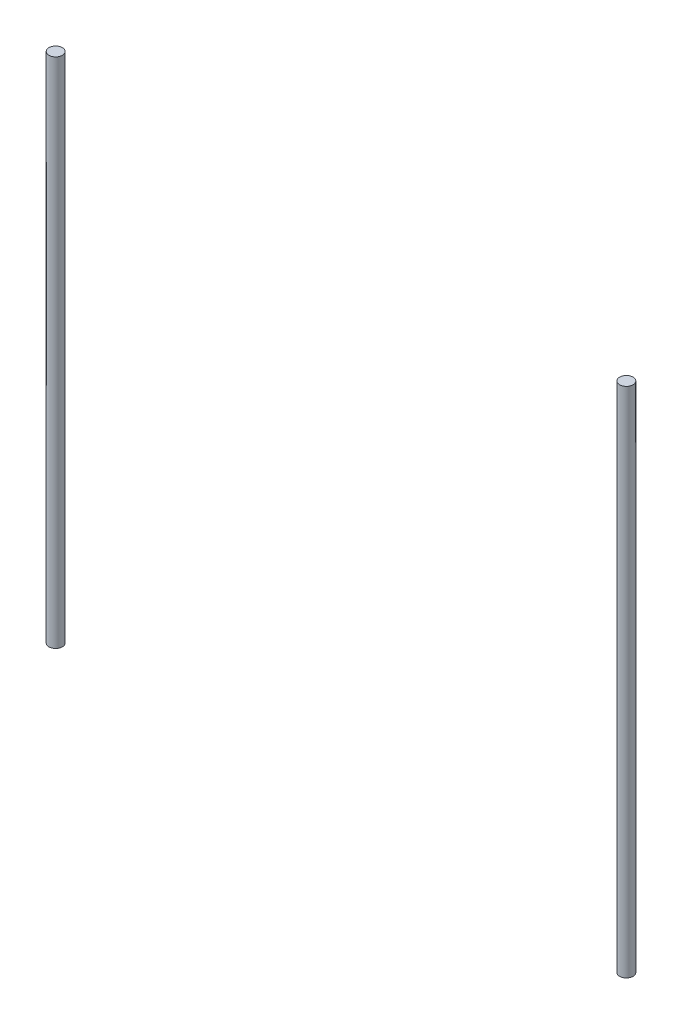
ISO-10303-21;
HEADER;
FILE_DESCRIPTION(('STEP AP214'),'2;1');
FILE_NAME('part.step','',(''),(''),'','','');
FILE_SCHEMA(('AUTOMOTIVE_DESIGN { 1 0 10303 214 1 1 1 1 }'));
ENDSEC;
DATA;
#1=APPLICATION_CONTEXT('core data for automotive mechanical design processes');
#2=APPLICATION_PROTOCOL_DEFINITION('international standard','automotive_design',2000,#1);
#3=PRODUCT_CONTEXT('',#1,'mechanical');
#4=PRODUCT('Part','Part','',(#3));
#5=PRODUCT_RELATED_PRODUCT_CATEGORY('part','',(#4));
#6=PRODUCT_DEFINITION_FORMATION('','',#4);
#7=PRODUCT_DEFINITION_CONTEXT('part definition',#1,'design');
#8=PRODUCT_DEFINITION('design','',#6,#7);
#9=PRODUCT_DEFINITION_SHAPE('','',#8);
#10=(LENGTH_UNIT() NAMED_UNIT(*) SI_UNIT(.MILLI.,.METRE.));
#11=(NAMED_UNIT(*) PLANE_ANGLE_UNIT() SI_UNIT($,.RADIAN.));
#12=(NAMED_UNIT(*) SI_UNIT($,.STERADIAN.) SOLID_ANGLE_UNIT());
#13=UNCERTAINTY_MEASURE_WITH_UNIT(LENGTH_MEASURE(1.E-05),#10,'distance_accuracy_value','');
#14=(GEOMETRIC_REPRESENTATION_CONTEXT(3) GLOBAL_UNCERTAINTY_ASSIGNED_CONTEXT((#13)) GLOBAL_UNIT_ASSIGNED_CONTEXT((#10,
#11,#12)) REPRESENTATION_CONTEXT('',''));
#15=CARTESIAN_POINT('',(0.,0.,0.));
#16=DIRECTION('',(0.,0.,1.));
#17=DIRECTION('',(1.,0.,0.));
#18=AXIS2_PLACEMENT_3D('',#15,#16,#17);
#19=CARTESIAN_POINT('',(-68.3434798742715,397.339775395496,369.677889561147));
#20=DIRECTION('',(0.,-1.,0.));
#21=DIRECTION('',(0.,0.,-1.));
#22=AXIS2_PLACEMENT_3D('',#19,#20,#21);
#23=PLANE('',#22);
#24=CARTESIAN_POINT('',(-68.3434798742715,397.339775395496,369.677889561147));
#25=DIRECTION('',(0.,-1.,0.));
#26=DIRECTION('',(0.,0.,-1.));
#27=AXIS2_PLACEMENT_3D('',#24,#25,#26);
#28=CIRCLE('',#27,4.);
#29=CARTESIAN_POINT('',(-68.3434798742715,397.339775395496,365.677889561147));
#30=VERTEX_POINT('',#29);
#31=EDGE_CURVE('P0_E17',#30,#30,#28,.T.);
#32=ORIENTED_EDGE('',*,*,#31,.F.);
#33=EDGE_LOOP('',(#32));
#34=FACE_BOUND('',#33,.T.);
#35=ADVANCED_FACE('P0_F14',(#34),#23,.F.);
#36=CARTESIAN_POINT('',(-68.3434798742715,90.3397753954964,369.677889561147));
#37=DIRECTION('',(0.,-1.,0.));
#38=DIRECTION('',(0.,0.,-1.));
#39=AXIS2_PLACEMENT_3D('',#36,#37,#38);
#40=PLANE('',#39);
#41=CARTESIAN_POINT('',(-68.3434798742715,90.3397753954964,369.677889561147));
#42=DIRECTION('',(0.,-1.,0.));
#43=DIRECTION('',(0.,0.,-1.));
#44=AXIS2_PLACEMENT_3D('',#41,#42,#43);
#45=CIRCLE('',#44,4.);
#46=CARTESIAN_POINT('',(-68.3434798742715,90.3397753954964,365.677889561147));
#47=VERTEX_POINT('',#46);
#48=EDGE_CURVE('P0_E10',#47,#47,#45,.F.);
#49=ORIENTED_EDGE('',*,*,#48,.F.);
#50=EDGE_LOOP('',(#49));
#51=FACE_BOUND('',#50,.T.);
#52=ADVANCED_FACE('P0_F29',(#51),#40,.T.);
#53=CARTESIAN_POINT('',(-68.3434798742715,397.339775395496,369.677889561147));
#54=DIRECTION('',(0.,-1.,0.));
#55=DIRECTION('',(0.,0.,-1.));
#56=AXIS2_PLACEMENT_3D('',#53,#54,#55);
#57=CYLINDRICAL_SURFACE('',#56,4.);
#58=ORIENTED_EDGE('',*,*,#48,.T.);
#59=EDGE_LOOP('',(#58));
#60=FACE_BOUND('',#59,.T.);
#61=ORIENTED_EDGE('',*,*,#31,.T.);
#62=EDGE_LOOP('',(#61));
#63=FACE_BOUND('',#62,.T.);
#64=ADVANCED_FACE('P0_F26',(#60,#63),#57,.T.);
#65=CLOSED_SHELL('',(#35,#52,#64));
#66=MANIFOLD_SOLID_BREP('P0_B1',#65);
#67=CARTESIAN_POINT('',(273.59737779005,397.339775395496,369.677889561146));
#68=DIRECTION('',(0.,-1.,0.));
#69=DIRECTION('',(0.,0.,-1.));
#70=AXIS2_PLACEMENT_3D('',#67,#68,#69);
#71=PLANE('',#70);
#72=CARTESIAN_POINT('',(273.59737779005,397.339775395496,369.677889561146));
#73=DIRECTION('',(0.,-1.,0.));
#74=DIRECTION('',(0.,0.,-1.));
#75=AXIS2_PLACEMENT_3D('',#72,#73,#74);
#76=CIRCLE('',#75,4.);
#77=CARTESIAN_POINT('',(273.59737779005,397.339775395496,365.677889561146));
#78=VERTEX_POINT('',#77);
#79=EDGE_CURVE('P1_E17',#78,#78,#76,.T.);
#80=ORIENTED_EDGE('',*,*,#79,.F.);
#81=EDGE_LOOP('',(#80));
#82=FACE_BOUND('',#81,.T.);
#83=ADVANCED_FACE('P1_F14',(#82),#71,.F.);
#84=CARTESIAN_POINT('',(273.59737779005,90.3397753954964,369.677889561146));
#85=DIRECTION('',(0.,-1.,0.));
#86=DIRECTION('',(0.,0.,-1.));
#87=AXIS2_PLACEMENT_3D('',#84,#85,#86);
#88=PLANE('',#87);
#89=CARTESIAN_POINT('',(273.59737779005,90.3397753954964,369.677889561146));
#90=DIRECTION('',(0.,-1.,0.));
#91=DIRECTION('',(0.,0.,-1.));
#92=AXIS2_PLACEMENT_3D('',#89,#90,#91);
#93=CIRCLE('',#92,4.);
#94=CARTESIAN_POINT('',(273.59737779005,90.3397753954964,365.677889561146));
#95=VERTEX_POINT('',#94);
#96=EDGE_CURVE('P1_E10',#95,#95,#93,.F.);
#97=ORIENTED_EDGE('',*,*,#96,.F.);
#98=EDGE_LOOP('',(#97));
#99=FACE_BOUND('',#98,.T.);
#100=ADVANCED_FACE('P1_F29',(#99),#88,.T.);
#101=CARTESIAN_POINT('',(273.59737779005,397.339775395496,369.677889561146));
#102=DIRECTION('',(0.,-1.,0.));
#103=DIRECTION('',(0.,0.,-1.));
#104=AXIS2_PLACEMENT_3D('',#101,#102,#103);
#105=CYLINDRICAL_SURFACE('',#104,4.);
#106=ORIENTED_EDGE('',*,*,#96,.T.);
#107=EDGE_LOOP('',(#106));
#108=FACE_BOUND('',#107,.T.);
#109=ORIENTED_EDGE('',*,*,#79,.T.);
#110=EDGE_LOOP('',(#109));
#111=FACE_BOUND('',#110,.T.);
#112=ADVANCED_FACE('P1_F26',(#108,#111),#105,.T.);
#113=CLOSED_SHELL('',(#83,#100,#112));
#114=MANIFOLD_SOLID_BREP('P1_B1',#113);
#115=ADVANCED_BREP_SHAPE_REPRESENTATION('',(#18,#66,#114),#14);
#116=SHAPE_DEFINITION_REPRESENTATION(#9,#115);
ENDSEC;
END-ISO-10303-21;
